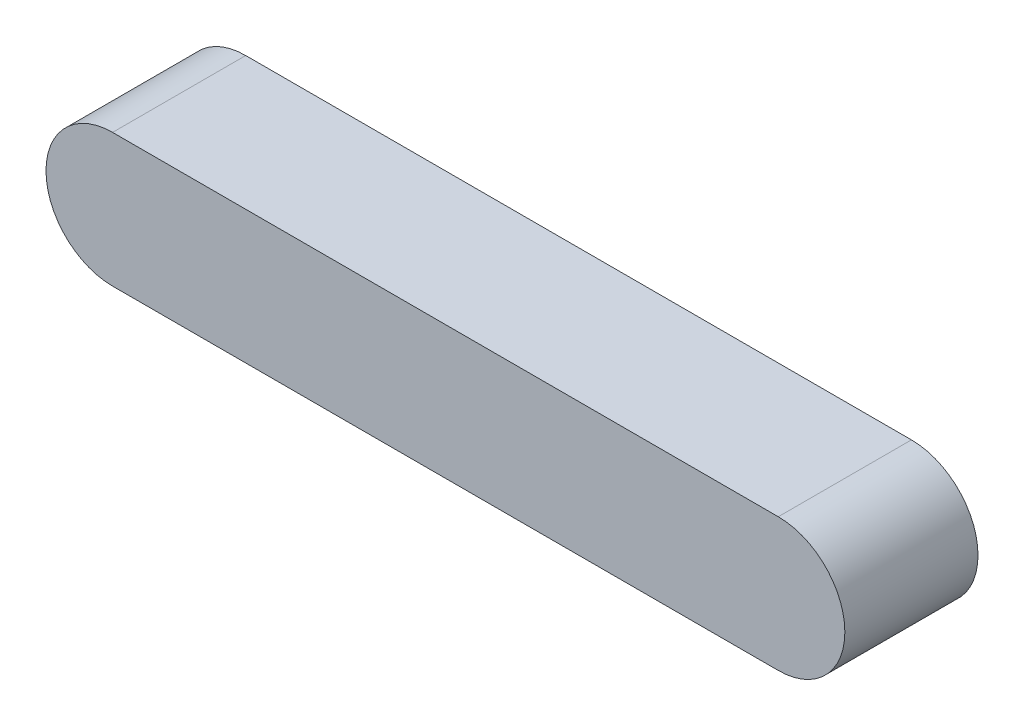
ISO-10303-21;
HEADER;
FILE_DESCRIPTION(('STEP AP214'),'2;1');
FILE_NAME('part.step','',(''),(''),'','','');
FILE_SCHEMA(('AUTOMOTIVE_DESIGN { 1 0 10303 214 1 1 1 1 }'));
ENDSEC;
DATA;
#1=APPLICATION_CONTEXT('core data for automotive mechanical design processes');
#2=APPLICATION_PROTOCOL_DEFINITION('international standard','automotive_design',2000,#1);
#3=PRODUCT_CONTEXT('',#1,'mechanical');
#4=PRODUCT('Part','Part','',(#3));
#5=PRODUCT_RELATED_PRODUCT_CATEGORY('part','',(#4));
#6=PRODUCT_DEFINITION_FORMATION('','',#4);
#7=PRODUCT_DEFINITION_CONTEXT('part definition',#1,'design');
#8=PRODUCT_DEFINITION('design','',#6,#7);
#9=PRODUCT_DEFINITION_SHAPE('','',#8);
#10=(LENGTH_UNIT() NAMED_UNIT(*) SI_UNIT(.MILLI.,.METRE.));
#11=(NAMED_UNIT(*) PLANE_ANGLE_UNIT() SI_UNIT($,.RADIAN.));
#12=(NAMED_UNIT(*) SI_UNIT($,.STERADIAN.) SOLID_ANGLE_UNIT());
#13=UNCERTAINTY_MEASURE_WITH_UNIT(LENGTH_MEASURE(1.E-05),#10,'distance_accuracy_value','');
#14=(GEOMETRIC_REPRESENTATION_CONTEXT(3) GLOBAL_UNCERTAINTY_ASSIGNED_CONTEXT((#13)) GLOBAL_UNIT_ASSIGNED_CONTEXT((#10,
#11,#12)) REPRESENTATION_CONTEXT('',''));
#15=CARTESIAN_POINT('',(0.,0.,0.));
#16=DIRECTION('',(0.,0.,1.));
#17=DIRECTION('',(1.,0.,0.));
#18=AXIS2_PLACEMENT_3D('',#15,#16,#17);
#19=CARTESIAN_POINT('',(0.,-1.,2.));
#20=DIRECTION('',(0.,0.,-1.));
#21=DIRECTION('',(-1.,0.,0.));
#22=AXIS2_PLACEMENT_3D('',#19,#20,#21);
#23=CYLINDRICAL_SURFACE('',#22,1.);
#24=CARTESIAN_POINT('',(0.,-1.,0.));
#25=DIRECTION('',(0.,0.,1.));
#26=DIRECTION('',(-1.,0.,0.));
#27=AXIS2_PLACEMENT_3D('',#24,#25,#26);
#28=CIRCLE('',#27,1.);
#29=CARTESIAN_POINT('',(0.,0.,0.));
#30=VERTEX_POINT('',#29);
#31=CARTESIAN_POINT('',(0.,-2.,0.));
#32=VERTEX_POINT('',#31);
#33=EDGE_CURVE('E76',#30,#32,#28,.T.);
#34=ORIENTED_EDGE('',*,*,#33,.T.);
#35=DIRECTION('',(0.,0.,-1.));
#36=VECTOR('',#35,1.);
#37=CARTESIAN_POINT('',(0.,-2.,2.));
#38=LINE('',#37,#36);
#39=CARTESIAN_POINT('',(0.,-2.,2.));
#40=VERTEX_POINT('',#39);
#41=EDGE_CURVE('E11',#40,#32,#38,.T.);
#42=ORIENTED_EDGE('',*,*,#41,.F.);
#43=CARTESIAN_POINT('',(0.,-1.,2.));
#44=DIRECTION('',(0.,0.,1.));
#45=DIRECTION('',(-1.,0.,0.));
#46=AXIS2_PLACEMENT_3D('',#43,#44,#45);
#47=CIRCLE('',#46,1.);
#48=CARTESIAN_POINT('',(0.,0.,2.));
#49=VERTEX_POINT('',#48);
#50=EDGE_CURVE('E94',#49,#40,#47,.T.);
#51=ORIENTED_EDGE('',*,*,#50,.F.);
#52=DIRECTION('',(0.,0.,-1.));
#53=VECTOR('',#52,1.);
#54=CARTESIAN_POINT('',(0.,0.,2.));
#55=LINE('',#54,#53);
#56=EDGE_CURVE('E88',#49,#30,#55,.T.);
#57=ORIENTED_EDGE('',*,*,#56,.T.);
#58=EDGE_LOOP('',(#34,#42,#51,#57));
#59=FACE_BOUND('',#58,.T.);
#60=ADVANCED_FACE('F32',(#59),#23,.T.);
#61=CARTESIAN_POINT('',(10.,-2.,2.));
#62=DIRECTION('',(0.,1.,0.));
#63=DIRECTION('',(-1.,0.,0.));
#64=AXIS2_PLACEMENT_3D('',#61,#62,#63);
#65=PLANE('',#64);
#66=DIRECTION('',(1.,0.,0.));
#67=VECTOR('',#66,1.);
#68=CARTESIAN_POINT('',(10.,-2.,0.));
#69=LINE('',#68,#67);
#70=CARTESIAN_POINT('',(10.,-2.,0.));
#71=VERTEX_POINT('',#70);
#72=EDGE_CURVE('E72',#32,#71,#69,.T.);
#73=ORIENTED_EDGE('',*,*,#72,.T.);
#74=DIRECTION('',(0.,0.,-1.));
#75=VECTOR('',#74,1.);
#76=CARTESIAN_POINT('',(10.,-2.,2.));
#77=LINE('',#76,#75);
#78=CARTESIAN_POINT('',(10.,-2.,2.));
#79=VERTEX_POINT('',#78);
#80=EDGE_CURVE('E39',#79,#71,#77,.T.);
#81=ORIENTED_EDGE('',*,*,#80,.F.);
#82=DIRECTION('',(1.,0.,0.));
#83=VECTOR('',#82,1.);
#84=CARTESIAN_POINT('',(10.,-2.,2.));
#85=LINE('',#84,#83);
#86=EDGE_CURVE('E84',#40,#79,#85,.T.);
#87=ORIENTED_EDGE('',*,*,#86,.F.);
#88=ORIENTED_EDGE('',*,*,#41,.T.);
#89=EDGE_LOOP('',(#73,#81,#87,#88));
#90=FACE_BOUND('',#89,.T.);
#91=ADVANCED_FACE('F83',(#90),#65,.F.);
#92=CARTESIAN_POINT('',(10.,-1.,2.));
#93=DIRECTION('',(0.,0.,-1.));
#94=DIRECTION('',(-1.,0.,0.));
#95=AXIS2_PLACEMENT_3D('',#92,#93,#94);
#96=CYLINDRICAL_SURFACE('',#95,1.);
#97=CARTESIAN_POINT('',(10.,-1.,0.));
#98=DIRECTION('',(0.,0.,1.));
#99=DIRECTION('',(-1.,0.,0.));
#100=AXIS2_PLACEMENT_3D('',#97,#98,#99);
#101=CIRCLE('',#100,1.);
#102=CARTESIAN_POINT('',(10.,0.,0.));
#103=VERTEX_POINT('',#102);
#104=EDGE_CURVE('E77',#71,#103,#101,.T.);
#105=ORIENTED_EDGE('',*,*,#104,.T.);
#106=DIRECTION('',(0.,0.,-1.));
#107=VECTOR('',#106,1.);
#108=CARTESIAN_POINT('',(10.,0.,2.));
#109=LINE('',#108,#107);
#110=CARTESIAN_POINT('',(10.,0.,2.));
#111=VERTEX_POINT('',#110);
#112=EDGE_CURVE('E100',#111,#103,#109,.T.);
#113=ORIENTED_EDGE('',*,*,#112,.F.);
#114=CARTESIAN_POINT('',(10.,-1.,2.));
#115=DIRECTION('',(0.,0.,1.));
#116=DIRECTION('',(-1.,0.,0.));
#117=AXIS2_PLACEMENT_3D('',#114,#115,#116);
#118=CIRCLE('',#117,1.);
#119=EDGE_CURVE('E51',#79,#111,#118,.T.);
#120=ORIENTED_EDGE('',*,*,#119,.F.);
#121=ORIENTED_EDGE('',*,*,#80,.T.);
#122=EDGE_LOOP('',(#105,#113,#120,#121));
#123=FACE_BOUND('',#122,.T.);
#124=ADVANCED_FACE('F103',(#123),#96,.T.);
#125=CARTESIAN_POINT('',(0.,0.,2.));
#126=DIRECTION('',(0.,-1.,0.));
#127=DIRECTION('',(0.,0.,-1.));
#128=AXIS2_PLACEMENT_3D('',#125,#126,#127);
#129=PLANE('',#128);
#130=DIRECTION('',(-1.,0.,0.));
#131=VECTOR('',#130,1.);
#132=CARTESIAN_POINT('',(0.,0.,0.));
#133=LINE('',#132,#131);
#134=EDGE_CURVE('E92',#103,#30,#133,.T.);
#135=ORIENTED_EDGE('',*,*,#134,.T.);
#136=ORIENTED_EDGE('',*,*,#56,.F.);
#137=DIRECTION('',(-1.,0.,0.));
#138=VECTOR('',#137,1.);
#139=CARTESIAN_POINT('',(0.,0.,2.));
#140=LINE('',#139,#138);
#141=EDGE_CURVE('E46',#111,#49,#140,.T.);
#142=ORIENTED_EDGE('',*,*,#141,.F.);
#143=ORIENTED_EDGE('',*,*,#112,.T.);
#144=EDGE_LOOP('',(#135,#136,#142,#143));
#145=FACE_BOUND('',#144,.T.);
#146=ADVANCED_FACE('F105',(#145),#129,.F.);
#147=CARTESIAN_POINT('',(0.,-1.,2.));
#148=DIRECTION('',(0.,0.,-1.));
#149=DIRECTION('',(-1.,0.,0.));
#150=AXIS2_PLACEMENT_3D('',#147,#148,#149);
#151=PLANE('',#150);
#152=ORIENTED_EDGE('',*,*,#50,.T.);
#153=ORIENTED_EDGE('',*,*,#86,.T.);
#154=ORIENTED_EDGE('',*,*,#119,.T.);
#155=ORIENTED_EDGE('',*,*,#141,.T.);
#156=EDGE_LOOP('',(#152,#153,#154,#155));
#157=FACE_BOUND('',#156,.T.);
#158=ADVANCED_FACE('F106',(#157),#151,.F.);
#159=CARTESIAN_POINT('',(0.,-1.,0.));
#160=DIRECTION('',(0.,0.,-1.));
#161=DIRECTION('',(-1.,0.,0.));
#162=AXIS2_PLACEMENT_3D('',#159,#160,#161);
#163=PLANE('',#162);
#164=ORIENTED_EDGE('',*,*,#33,.F.);
#165=ORIENTED_EDGE('',*,*,#134,.F.);
#166=ORIENTED_EDGE('',*,*,#104,.F.);
#167=ORIENTED_EDGE('',*,*,#72,.F.);
#168=EDGE_LOOP('',(#164,#165,#166,#167));
#169=FACE_BOUND('',#168,.T.);
#170=ADVANCED_FACE('F73',(#169),#163,.T.);
#171=CLOSED_SHELL('',(#60,#91,#124,#146,#158,#170));
#172=MANIFOLD_SOLID_BREP('B2',#171);
#173=ADVANCED_BREP_SHAPE_REPRESENTATION('',(#18,#172),#14);
#174=SHAPE_DEFINITION_REPRESENTATION(#9,#173);
ENDSEC;
END-ISO-10303-21;
